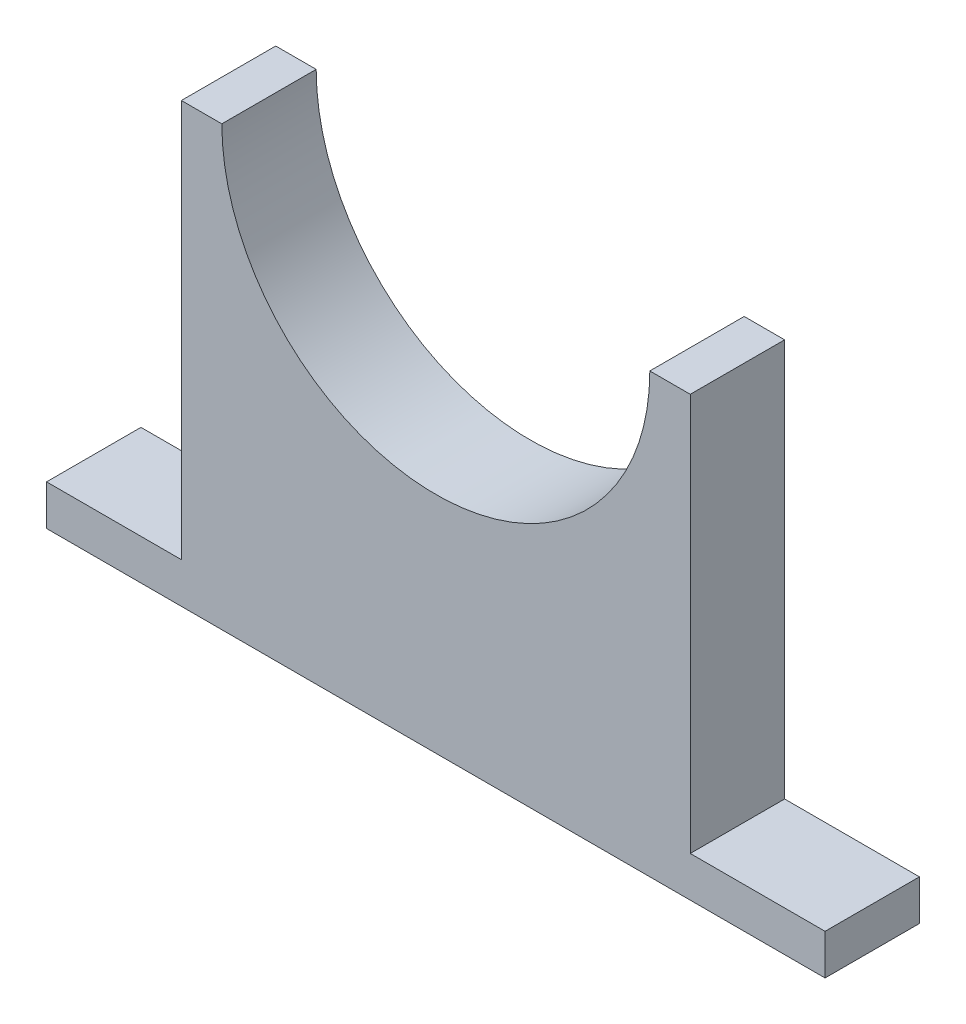
ISO-10303-21;
HEADER;
FILE_DESCRIPTION(('STEP AP214'),'2;1');
FILE_NAME('part.step','',(''),(''),'','','');
FILE_SCHEMA(('AUTOMOTIVE_DESIGN { 1 0 10303 214 1 1 1 1 }'));
ENDSEC;
DATA;
#1=APPLICATION_CONTEXT('core data for automotive mechanical design processes');
#2=APPLICATION_PROTOCOL_DEFINITION('international standard','automotive_design',2000,#1);
#3=PRODUCT_CONTEXT('',#1,'mechanical');
#4=PRODUCT('Part','Part','',(#3));
#5=PRODUCT_RELATED_PRODUCT_CATEGORY('part','',(#4));
#6=PRODUCT_DEFINITION_FORMATION('','',#4);
#7=PRODUCT_DEFINITION_CONTEXT('part definition',#1,'design');
#8=PRODUCT_DEFINITION('design','',#6,#7);
#9=PRODUCT_DEFINITION_SHAPE('','',#8);
#10=(LENGTH_UNIT() NAMED_UNIT(*) SI_UNIT(.MILLI.,.METRE.));
#11=(NAMED_UNIT(*) PLANE_ANGLE_UNIT() SI_UNIT($,.RADIAN.));
#12=(NAMED_UNIT(*) SI_UNIT($,.STERADIAN.) SOLID_ANGLE_UNIT());
#13=UNCERTAINTY_MEASURE_WITH_UNIT(LENGTH_MEASURE(1.E-05),#10,'distance_accuracy_value','');
#14=(GEOMETRIC_REPRESENTATION_CONTEXT(3) GLOBAL_UNCERTAINTY_ASSIGNED_CONTEXT((#13)) GLOBAL_UNIT_ASSIGNED_CONTEXT((#10,
#11,#12)) REPRESENTATION_CONTEXT('',''));
#15=CARTESIAN_POINT('',(0.,0.,0.));
#16=DIRECTION('',(0.,0.,1.));
#17=DIRECTION('',(1.,0.,0.));
#18=AXIS2_PLACEMENT_3D('',#15,#16,#17);
#19=CARTESIAN_POINT('',(0.,0.,7.));
#20=DIRECTION('',(0.,0.,-1.));
#21=DIRECTION('',(-1.,0.,0.));
#22=AXIS2_PLACEMENT_3D('',#19,#20,#21);
#23=CYLINDRICAL_SURFACE('',#22,15.875);
#24=CARTESIAN_POINT('',(0.,0.,0.));
#25=DIRECTION('',(0.,0.,-1.));
#26=DIRECTION('',(1.,0.,0.));
#27=AXIS2_PLACEMENT_3D('',#24,#25,#26);
#28=CIRCLE('',#27,15.875);
#29=CARTESIAN_POINT('',(15.875,0.,0.));
#30=VERTEX_POINT('',#29);
#31=CARTESIAN_POINT('',(-15.875,0.,0.));
#32=VERTEX_POINT('',#31);
#33=EDGE_CURVE('E141',#30,#32,#28,.T.);
#34=ORIENTED_EDGE('',*,*,#33,.T.);
#35=DIRECTION('',(0.,0.,-1.));
#36=VECTOR('',#35,1.);
#37=CARTESIAN_POINT('',(-15.875,0.,7.));
#38=LINE('',#37,#36);
#39=CARTESIAN_POINT('',(-15.875,0.,7.));
#40=VERTEX_POINT('',#39);
#41=EDGE_CURVE('E11',#40,#32,#38,.T.);
#42=ORIENTED_EDGE('',*,*,#41,.F.);
#43=CARTESIAN_POINT('',(0.,0.,7.));
#44=DIRECTION('',(0.,0.,-1.));
#45=DIRECTION('',(1.,0.,0.));
#46=AXIS2_PLACEMENT_3D('',#43,#44,#45);
#47=CIRCLE('',#46,15.875);
#48=CARTESIAN_POINT('',(15.875,0.,7.));
#49=VERTEX_POINT('',#48);
#50=EDGE_CURVE('E159',#49,#40,#47,.T.);
#51=ORIENTED_EDGE('',*,*,#50,.F.);
#52=DIRECTION('',(0.,0.,-1.));
#53=VECTOR('',#52,1.);
#54=CARTESIAN_POINT('',(15.875,0.,7.));
#55=LINE('',#54,#53);
#56=EDGE_CURVE('E137',#49,#30,#55,.T.);
#57=ORIENTED_EDGE('',*,*,#56,.T.);
#58=EDGE_LOOP('',(#34,#42,#51,#57));
#59=FACE_BOUND('',#58,.T.);
#60=ADVANCED_FACE('F33',(#59),#23,.F.);
#61=CARTESIAN_POINT('',(-15.875,0.,7.));
#62=DIRECTION('',(0.,-1.,0.));
#63=DIRECTION('',(1.,0.,0.));
#64=AXIS2_PLACEMENT_3D('',#61,#62,#63);
#65=PLANE('',#64);
#66=DIRECTION('',(-1.,0.,0.));
#67=VECTOR('',#66,1.);
#68=CARTESIAN_POINT('',(-15.875,0.,0.));
#69=LINE('',#68,#67);
#70=CARTESIAN_POINT('',(-18.875,0.,0.));
#71=VERTEX_POINT('',#70);
#72=EDGE_CURVE('E144',#32,#71,#69,.T.);
#73=ORIENTED_EDGE('',*,*,#72,.T.);
#74=DIRECTION('',(0.,0.,-1.));
#75=VECTOR('',#74,1.);
#76=CARTESIAN_POINT('',(-18.875,0.,7.));
#77=LINE('',#76,#75);
#78=CARTESIAN_POINT('',(-18.875,0.,7.));
#79=VERTEX_POINT('',#78);
#80=EDGE_CURVE('E41',#79,#71,#77,.T.);
#81=ORIENTED_EDGE('',*,*,#80,.F.);
#82=DIRECTION('',(-1.,0.,0.));
#83=VECTOR('',#82,1.);
#84=CARTESIAN_POINT('',(-15.875,0.,7.));
#85=LINE('',#84,#83);
#86=EDGE_CURVE('E98',#40,#79,#85,.T.);
#87=ORIENTED_EDGE('',*,*,#86,.F.);
#88=ORIENTED_EDGE('',*,*,#41,.T.);
#89=EDGE_LOOP('',(#73,#81,#87,#88));
#90=FACE_BOUND('',#89,.T.);
#91=ADVANCED_FACE('F208',(#90),#65,.F.);
#92=CARTESIAN_POINT('',(-18.875,0.,7.));
#93=DIRECTION('',(1.,0.,0.));
#94=DIRECTION('',(0.,1.,0.));
#95=AXIS2_PLACEMENT_3D('',#92,#93,#94);
#96=PLANE('',#95);
#97=DIRECTION('',(0.,-1.,0.));
#98=VECTOR('',#97,1.);
#99=CARTESIAN_POINT('',(-18.875,0.,0.));
#100=LINE('',#99,#98);
#101=CARTESIAN_POINT('',(-18.875,-29.5,0.));
#102=VERTEX_POINT('',#101);
#103=EDGE_CURVE('E146',#71,#102,#100,.T.);
#104=ORIENTED_EDGE('',*,*,#103,.T.);
#105=DIRECTION('',(0.,0.,-1.));
#106=VECTOR('',#105,1.);
#107=CARTESIAN_POINT('',(-18.875,-29.5,7.));
#108=LINE('',#107,#106);
#109=CARTESIAN_POINT('',(-18.875,-29.5,7.));
#110=VERTEX_POINT('',#109);
#111=EDGE_CURVE('E172',#110,#102,#108,.T.);
#112=ORIENTED_EDGE('',*,*,#111,.F.);
#113=DIRECTION('',(0.,-1.,0.));
#114=VECTOR('',#113,1.);
#115=CARTESIAN_POINT('',(-18.875,0.,7.));
#116=LINE('',#115,#114);
#117=EDGE_CURVE('E180',#79,#110,#116,.T.);
#118=ORIENTED_EDGE('',*,*,#117,.F.);
#119=ORIENTED_EDGE('',*,*,#80,.T.);
#120=EDGE_LOOP('',(#104,#112,#118,#119));
#121=FACE_BOUND('',#120,.T.);
#122=ADVANCED_FACE('F178',(#121),#96,.F.);
#123=CARTESIAN_POINT('',(-18.875,-29.5,7.));
#124=DIRECTION('',(0.,-1.,0.));
#125=DIRECTION('',(0.,0.,-1.));
#126=AXIS2_PLACEMENT_3D('',#123,#124,#125);
#127=PLANE('',#126);
#128=DIRECTION('',(-1.,0.,0.));
#129=VECTOR('',#128,1.);
#130=CARTESIAN_POINT('',(-18.875,-29.5,0.));
#131=LINE('',#130,#129);
#132=CARTESIAN_POINT('',(-28.875,-29.5,0.));
#133=VERTEX_POINT('',#132);
#134=EDGE_CURVE('E148',#102,#133,#131,.T.);
#135=ORIENTED_EDGE('',*,*,#134,.T.);
#136=DIRECTION('',(0.,0.,-1.));
#137=VECTOR('',#136,1.);
#138=CARTESIAN_POINT('',(-28.875,-29.5,7.));
#139=LINE('',#138,#137);
#140=CARTESIAN_POINT('',(-28.875,-29.5,7.));
#141=VERTEX_POINT('',#140);
#142=EDGE_CURVE('E169',#141,#133,#139,.T.);
#143=ORIENTED_EDGE('',*,*,#142,.F.);
#144=DIRECTION('',(-1.,0.,0.));
#145=VECTOR('',#144,1.);
#146=CARTESIAN_POINT('',(-18.875,-29.5,7.));
#147=LINE('',#146,#145);
#148=EDGE_CURVE('E198',#110,#141,#147,.T.);
#149=ORIENTED_EDGE('',*,*,#148,.F.);
#150=ORIENTED_EDGE('',*,*,#111,.T.);
#151=EDGE_LOOP('',(#135,#143,#149,#150));
#152=FACE_BOUND('',#151,.T.);
#153=ADVANCED_FACE('F189',(#152),#127,.F.);
#154=CARTESIAN_POINT('',(-28.875,-29.5,7.));
#155=DIRECTION('',(1.,0.,0.));
#156=DIRECTION('',(0.,0.,-1.));
#157=AXIS2_PLACEMENT_3D('',#154,#155,#156);
#158=PLANE('',#157);
#159=DIRECTION('',(0.,-1.,0.));
#160=VECTOR('',#159,1.);
#161=CARTESIAN_POINT('',(-28.875,-29.5,0.));
#162=LINE('',#161,#160);
#163=CARTESIAN_POINT('',(-28.875,-32.5,0.));
#164=VERTEX_POINT('',#163);
#165=EDGE_CURVE('E150',#133,#164,#162,.T.);
#166=ORIENTED_EDGE('',*,*,#165,.T.);
#167=DIRECTION('',(0.,0.,-1.));
#168=VECTOR('',#167,1.);
#169=CARTESIAN_POINT('',(-28.875,-32.5,7.));
#170=LINE('',#169,#168);
#171=CARTESIAN_POINT('',(-28.875,-32.5,7.));
#172=VERTEX_POINT('',#171);
#173=EDGE_CURVE('E166',#172,#164,#170,.T.);
#174=ORIENTED_EDGE('',*,*,#173,.F.);
#175=DIRECTION('',(0.,-1.,0.));
#176=VECTOR('',#175,1.);
#177=CARTESIAN_POINT('',(-28.875,-29.5,7.));
#178=LINE('',#177,#176);
#179=EDGE_CURVE('E195',#141,#172,#178,.T.);
#180=ORIENTED_EDGE('',*,*,#179,.F.);
#181=ORIENTED_EDGE('',*,*,#142,.T.);
#182=EDGE_LOOP('',(#166,#174,#180,#181));
#183=FACE_BOUND('',#182,.T.);
#184=ADVANCED_FACE('F193',(#183),#158,.F.);
#185=CARTESIAN_POINT('',(-28.875,-32.5,7.));
#186=DIRECTION('',(0.,1.,0.));
#187=DIRECTION('',(0.,0.,1.));
#188=AXIS2_PLACEMENT_3D('',#185,#186,#187);
#189=PLANE('',#188);
#190=DIRECTION('',(1.,0.,0.));
#191=VECTOR('',#190,1.);
#192=CARTESIAN_POINT('',(-28.875,-32.5,0.));
#193=LINE('',#192,#191);
#194=CARTESIAN_POINT('',(28.875,-32.5,0.));
#195=VERTEX_POINT('',#194);
#196=EDGE_CURVE('E152',#164,#195,#193,.T.);
#197=ORIENTED_EDGE('',*,*,#196,.T.);
#198=DIRECTION('',(0.,0.,-1.));
#199=VECTOR('',#198,1.);
#200=CARTESIAN_POINT('',(28.875,-32.5,7.));
#201=LINE('',#200,#199);
#202=CARTESIAN_POINT('',(28.875,-32.5,7.));
#203=VERTEX_POINT('',#202);
#204=EDGE_CURVE('E163',#203,#195,#201,.T.);
#205=ORIENTED_EDGE('',*,*,#204,.F.);
#206=DIRECTION('',(1.,0.,0.));
#207=VECTOR('',#206,1.);
#208=CARTESIAN_POINT('',(-28.875,-32.5,7.));
#209=LINE('',#208,#207);
#210=EDGE_CURVE('E197',#172,#203,#209,.T.);
#211=ORIENTED_EDGE('',*,*,#210,.F.);
#212=ORIENTED_EDGE('',*,*,#173,.T.);
#213=EDGE_LOOP('',(#197,#205,#211,#212));
#214=FACE_BOUND('',#213,.T.);
#215=ADVANCED_FACE('F220',(#214),#189,.F.);
#216=CARTESIAN_POINT('',(28.875,-32.5,7.));
#217=DIRECTION('',(-1.,0.,0.));
#218=DIRECTION('',(0.,0.,1.));
#219=AXIS2_PLACEMENT_3D('',#216,#217,#218);
#220=PLANE('',#219);
#221=DIRECTION('',(0.,1.,0.));
#222=VECTOR('',#221,1.);
#223=CARTESIAN_POINT('',(28.875,-32.5,0.));
#224=LINE('',#223,#222);
#225=CARTESIAN_POINT('',(28.875,-29.5,0.));
#226=VERTEX_POINT('',#225);
#227=EDGE_CURVE('E154',#195,#226,#224,.T.);
#228=ORIENTED_EDGE('',*,*,#227,.T.);
#229=DIRECTION('',(0.,0.,-1.));
#230=VECTOR('',#229,1.);
#231=CARTESIAN_POINT('',(28.875,-29.5,7.));
#232=LINE('',#231,#230);
#233=CARTESIAN_POINT('',(28.875,-29.5,7.));
#234=VERTEX_POINT('',#233);
#235=EDGE_CURVE('E132',#234,#226,#232,.T.);
#236=ORIENTED_EDGE('',*,*,#235,.F.);
#237=DIRECTION('',(0.,1.,0.));
#238=VECTOR('',#237,1.);
#239=CARTESIAN_POINT('',(28.875,-32.5,7.));
#240=LINE('',#239,#238);
#241=EDGE_CURVE('E123',#203,#234,#240,.T.);
#242=ORIENTED_EDGE('',*,*,#241,.F.);
#243=ORIENTED_EDGE('',*,*,#204,.T.);
#244=EDGE_LOOP('',(#228,#236,#242,#243));
#245=FACE_BOUND('',#244,.T.);
#246=ADVANCED_FACE('F223',(#245),#220,.F.);
#247=CARTESIAN_POINT('',(28.875,-29.5,7.));
#248=DIRECTION('',(0.,-1.,0.));
#249=DIRECTION('',(0.,0.,-1.));
#250=AXIS2_PLACEMENT_3D('',#247,#248,#249);
#251=PLANE('',#250);
#252=DIRECTION('',(-1.,0.,0.));
#253=VECTOR('',#252,1.);
#254=CARTESIAN_POINT('',(28.875,-29.5,0.));
#255=LINE('',#254,#253);
#256=CARTESIAN_POINT('',(18.875,-29.5,0.));
#257=VERTEX_POINT('',#256);
#258=EDGE_CURVE('E131',#226,#257,#255,.T.);
#259=ORIENTED_EDGE('',*,*,#258,.T.);
#260=DIRECTION('',(0.,0.,-1.));
#261=VECTOR('',#260,1.);
#262=CARTESIAN_POINT('',(18.875,-29.5,7.));
#263=LINE('',#262,#261);
#264=CARTESIAN_POINT('',(18.875,-29.5,7.));
#265=VERTEX_POINT('',#264);
#266=EDGE_CURVE('E128',#265,#257,#263,.T.);
#267=ORIENTED_EDGE('',*,*,#266,.F.);
#268=DIRECTION('',(-1.,0.,0.));
#269=VECTOR('',#268,1.);
#270=CARTESIAN_POINT('',(28.875,-29.5,7.));
#271=LINE('',#270,#269);
#272=EDGE_CURVE('E117',#234,#265,#271,.T.);
#273=ORIENTED_EDGE('',*,*,#272,.F.);
#274=ORIENTED_EDGE('',*,*,#235,.T.);
#275=EDGE_LOOP('',(#259,#267,#273,#274));
#276=FACE_BOUND('',#275,.T.);
#277=ADVANCED_FACE('F129',(#276),#251,.F.);
#278=CARTESIAN_POINT('',(18.875,-29.5,7.));
#279=DIRECTION('',(-1.,0.,0.));
#280=DIRECTION('',(0.,-1.,0.));
#281=AXIS2_PLACEMENT_3D('',#278,#279,#280);
#282=PLANE('',#281);
#283=DIRECTION('',(0.,1.,0.));
#284=VECTOR('',#283,1.);
#285=CARTESIAN_POINT('',(18.875,-29.5,0.));
#286=LINE('',#285,#284);
#287=CARTESIAN_POINT('',(18.875,0.,0.));
#288=VERTEX_POINT('',#287);
#289=EDGE_CURVE('E84',#257,#288,#286,.T.);
#290=ORIENTED_EDGE('',*,*,#289,.T.);
#291=DIRECTION('',(0.,0.,-1.));
#292=VECTOR('',#291,1.);
#293=CARTESIAN_POINT('',(18.875,0.,7.));
#294=LINE('',#293,#292);
#295=CARTESIAN_POINT('',(18.875,0.,7.));
#296=VERTEX_POINT('',#295);
#297=EDGE_CURVE('E133',#296,#288,#294,.T.);
#298=ORIENTED_EDGE('',*,*,#297,.F.);
#299=DIRECTION('',(0.,1.,0.));
#300=VECTOR('',#299,1.);
#301=CARTESIAN_POINT('',(18.875,-29.5,7.));
#302=LINE('',#301,#300);
#303=EDGE_CURVE('E121',#265,#296,#302,.T.);
#304=ORIENTED_EDGE('',*,*,#303,.F.);
#305=ORIENTED_EDGE('',*,*,#266,.T.);
#306=EDGE_LOOP('',(#290,#298,#304,#305));
#307=FACE_BOUND('',#306,.T.);
#308=ADVANCED_FACE('F135',(#307),#282,.F.);
#309=CARTESIAN_POINT('',(18.875,0.,7.));
#310=DIRECTION('',(0.,-1.,0.));
#311=DIRECTION('',(1.,0.,0.));
#312=AXIS2_PLACEMENT_3D('',#309,#310,#311);
#313=PLANE('',#312);
#314=DIRECTION('',(-1.,0.,0.));
#315=VECTOR('',#314,1.);
#316=CARTESIAN_POINT('',(18.875,0.,0.));
#317=LINE('',#316,#315);
#318=EDGE_CURVE('E90',#288,#30,#317,.T.);
#319=ORIENTED_EDGE('',*,*,#318,.T.);
#320=ORIENTED_EDGE('',*,*,#56,.F.);
#321=DIRECTION('',(-1.,0.,0.));
#322=VECTOR('',#321,1.);
#323=CARTESIAN_POINT('',(18.875,0.,7.));
#324=LINE('',#323,#322);
#325=EDGE_CURVE('E49',#296,#49,#324,.T.);
#326=ORIENTED_EDGE('',*,*,#325,.F.);
#327=ORIENTED_EDGE('',*,*,#297,.T.);
#328=EDGE_LOOP('',(#319,#320,#326,#327));
#329=FACE_BOUND('',#328,.T.);
#330=ADVANCED_FACE('F232',(#329),#313,.F.);
#331=CARTESIAN_POINT('',(0.,0.,7.));
#332=DIRECTION('',(0.,0.,1.));
#333=DIRECTION('',(1.,0.,0.));
#334=AXIS2_PLACEMENT_3D('',#331,#332,#333);
#335=PLANE('',#334);
#336=ORIENTED_EDGE('',*,*,#50,.T.);
#337=ORIENTED_EDGE('',*,*,#86,.T.);
#338=ORIENTED_EDGE('',*,*,#117,.T.);
#339=ORIENTED_EDGE('',*,*,#148,.T.);
#340=ORIENTED_EDGE('',*,*,#179,.T.);
#341=ORIENTED_EDGE('',*,*,#210,.T.);
#342=ORIENTED_EDGE('',*,*,#241,.T.);
#343=ORIENTED_EDGE('',*,*,#272,.T.);
#344=ORIENTED_EDGE('',*,*,#303,.T.);
#345=ORIENTED_EDGE('',*,*,#325,.T.);
#346=EDGE_LOOP('',(#336,#337,#338,#339,#340,#341,#342,#343,#344,#345));
#347=FACE_BOUND('',#346,.T.);
#348=ADVANCED_FACE('F119',(#347),#335,.T.);
#349=CARTESIAN_POINT('',(0.,0.,0.));
#350=DIRECTION('',(0.,0.,1.));
#351=DIRECTION('',(1.,0.,0.));
#352=AXIS2_PLACEMENT_3D('',#349,#350,#351);
#353=PLANE('',#352);
#354=ORIENTED_EDGE('',*,*,#33,.F.);
#355=ORIENTED_EDGE('',*,*,#318,.F.);
#356=ORIENTED_EDGE('',*,*,#289,.F.);
#357=ORIENTED_EDGE('',*,*,#258,.F.);
#358=ORIENTED_EDGE('',*,*,#227,.F.);
#359=ORIENTED_EDGE('',*,*,#196,.F.);
#360=ORIENTED_EDGE('',*,*,#165,.F.);
#361=ORIENTED_EDGE('',*,*,#134,.F.);
#362=ORIENTED_EDGE('',*,*,#103,.F.);
#363=ORIENTED_EDGE('',*,*,#72,.F.);
#364=EDGE_LOOP('',(#354,#355,#356,#357,#358,#359,#360,#361,#362,#363));
#365=FACE_BOUND('',#364,.T.);
#366=ADVANCED_FACE('F184',(#365),#353,.F.);
#367=CLOSED_SHELL('',(#60,#91,#122,#153,#184,#215,#246,#277,#308,#330,#348,#366));
#368=MANIFOLD_SOLID_BREP('B2',#367);
#369=ADVANCED_BREP_SHAPE_REPRESENTATION('',(#18,#368),#14);
#370=SHAPE_DEFINITION_REPRESENTATION(#9,#369);
ENDSEC;
END-ISO-10303-21;
